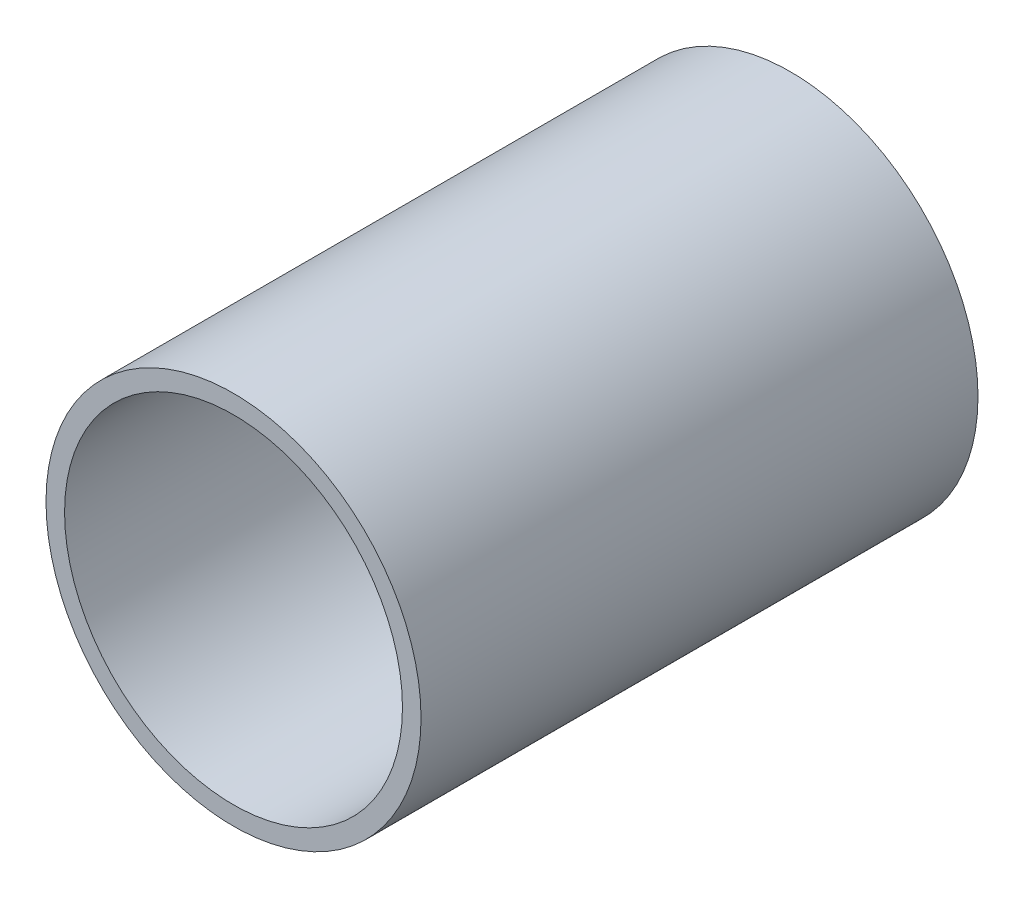
ISO-10303-21;
HEADER;
FILE_DESCRIPTION(('STEP AP214'),'2;1');
FILE_NAME('part.step','',(''),(''),'','','');
FILE_SCHEMA(('AUTOMOTIVE_DESIGN { 1 0 10303 214 1 1 1 1 }'));
ENDSEC;
DATA;
#1=APPLICATION_CONTEXT('core data for automotive mechanical design processes');
#2=APPLICATION_PROTOCOL_DEFINITION('international standard','automotive_design',2000,#1);
#3=PRODUCT_CONTEXT('',#1,'mechanical');
#4=PRODUCT('Part','Part','',(#3));
#5=PRODUCT_RELATED_PRODUCT_CATEGORY('part','',(#4));
#6=PRODUCT_DEFINITION_FORMATION('','',#4);
#7=PRODUCT_DEFINITION_CONTEXT('part definition',#1,'design');
#8=PRODUCT_DEFINITION('design','',#6,#7);
#9=PRODUCT_DEFINITION_SHAPE('','',#8);
#10=(LENGTH_UNIT() NAMED_UNIT(*) SI_UNIT(.MILLI.,.METRE.));
#11=(NAMED_UNIT(*) PLANE_ANGLE_UNIT() SI_UNIT($,.RADIAN.));
#12=(NAMED_UNIT(*) SI_UNIT($,.STERADIAN.) SOLID_ANGLE_UNIT());
#13=UNCERTAINTY_MEASURE_WITH_UNIT(LENGTH_MEASURE(1.E-05),#10,'distance_accuracy_value','');
#14=(GEOMETRIC_REPRESENTATION_CONTEXT(3) GLOBAL_UNCERTAINTY_ASSIGNED_CONTEXT((#13)) GLOBAL_UNIT_ASSIGNED_CONTEXT((#10,
#11,#12)) REPRESENTATION_CONTEXT('',''));
#15=CARTESIAN_POINT('',(0.,0.,0.));
#16=DIRECTION('',(0.,0.,1.));
#17=DIRECTION('',(1.,0.,0.));
#18=AXIS2_PLACEMENT_3D('',#15,#16,#17);
#19=CARTESIAN_POINT('',(0.,0.,30.));
#20=DIRECTION('',(0.,0.,1.));
#21=DIRECTION('',(1.,0.,0.));
#22=AXIS2_PLACEMENT_3D('',#19,#20,#21);
#23=PLANE('',#22);
#24=CARTESIAN_POINT('',(0.,0.,30.));
#25=DIRECTION('',(0.,0.,1.));
#26=DIRECTION('',(1.,0.,0.));
#27=AXIS2_PLACEMENT_3D('',#24,#25,#26);
#28=CIRCLE('',#27,10.1);
#29=CARTESIAN_POINT('',(10.1,0.,30.));
#30=VERTEX_POINT('',#29);
#31=EDGE_CURVE('E10',#30,#30,#28,.T.);
#32=ORIENTED_EDGE('',*,*,#31,.T.);
#33=EDGE_LOOP('',(#32));
#34=FACE_BOUND('',#33,.T.);
#35=CARTESIAN_POINT('',(0.,0.,30.));
#36=DIRECTION('',(0.,0.,1.));
#37=DIRECTION('',(1.,0.,0.));
#38=AXIS2_PLACEMENT_3D('',#35,#36,#37);
#39=CIRCLE('',#38,9.1);
#40=CARTESIAN_POINT('',(9.1,0.,30.));
#41=VERTEX_POINT('',#40);
#42=EDGE_CURVE('E50',#41,#41,#39,.T.);
#43=ORIENTED_EDGE('',*,*,#42,.F.);
#44=EDGE_LOOP('',(#43));
#45=FACE_BOUND('',#44,.T.);
#46=ADVANCED_FACE('F39',(#34,#45),#23,.T.);
#47=CARTESIAN_POINT('',(0.,0.,0.));
#48=DIRECTION('',(0.,0.,1.));
#49=DIRECTION('',(1.,0.,0.));
#50=AXIS2_PLACEMENT_3D('',#47,#48,#49);
#51=PLANE('',#50);
#52=CARTESIAN_POINT('',(0.,0.,0.));
#53=DIRECTION('',(0.,0.,1.));
#54=DIRECTION('',(1.,0.,0.));
#55=AXIS2_PLACEMENT_3D('',#52,#53,#54);
#56=CIRCLE('',#55,10.1);
#57=CARTESIAN_POINT('',(10.1,0.,0.));
#58=VERTEX_POINT('',#57);
#59=EDGE_CURVE('E43',#58,#58,#56,.T.);
#60=ORIENTED_EDGE('',*,*,#59,.F.);
#61=EDGE_LOOP('',(#60));
#62=FACE_BOUND('',#61,.T.);
#63=CARTESIAN_POINT('',(0.,0.,0.));
#64=DIRECTION('',(0.,0.,1.));
#65=DIRECTION('',(1.,0.,0.));
#66=AXIS2_PLACEMENT_3D('',#63,#64,#65);
#67=CIRCLE('',#66,9.1);
#68=CARTESIAN_POINT('',(9.1,0.,0.));
#69=VERTEX_POINT('',#68);
#70=EDGE_CURVE('E52',#69,#69,#67,.T.);
#71=ORIENTED_EDGE('',*,*,#70,.T.);
#72=EDGE_LOOP('',(#71));
#73=FACE_BOUND('',#72,.T.);
#74=ADVANCED_FACE('F62',(#62,#73),#51,.F.);
#75=CARTESIAN_POINT('',(0.,0.,30.));
#76=DIRECTION('',(0.,0.,-1.));
#77=DIRECTION('',(-1.,0.,0.));
#78=AXIS2_PLACEMENT_3D('',#75,#76,#77);
#79=CYLINDRICAL_SURFACE('',#78,10.1);
#80=ORIENTED_EDGE('',*,*,#31,.F.);
#81=EDGE_LOOP('',(#80));
#82=FACE_BOUND('',#81,.T.);
#83=ORIENTED_EDGE('',*,*,#59,.T.);
#84=EDGE_LOOP('',(#83));
#85=FACE_BOUND('',#84,.T.);
#86=ADVANCED_FACE('F41',(#82,#85),#79,.T.);
#87=CARTESIAN_POINT('',(0.,0.,30.));
#88=DIRECTION('',(0.,0.,-1.));
#89=DIRECTION('',(-1.,0.,0.));
#90=AXIS2_PLACEMENT_3D('',#87,#88,#89);
#91=CYLINDRICAL_SURFACE('',#90,9.1);
#92=ORIENTED_EDGE('',*,*,#42,.T.);
#93=EDGE_LOOP('',(#92));
#94=FACE_BOUND('',#93,.T.);
#95=ORIENTED_EDGE('',*,*,#70,.F.);
#96=EDGE_LOOP('',(#95));
#97=FACE_BOUND('',#96,.T.);
#98=ADVANCED_FACE('F58',(#94,#97),#91,.F.);
#99=CLOSED_SHELL('',(#46,#74,#86,#98));
#100=MANIFOLD_SOLID_BREP('B2',#99);
#101=ADVANCED_BREP_SHAPE_REPRESENTATION('',(#18,#100),#14);
#102=SHAPE_DEFINITION_REPRESENTATION(#9,#101);
ENDSEC;
END-ISO-10303-21;
